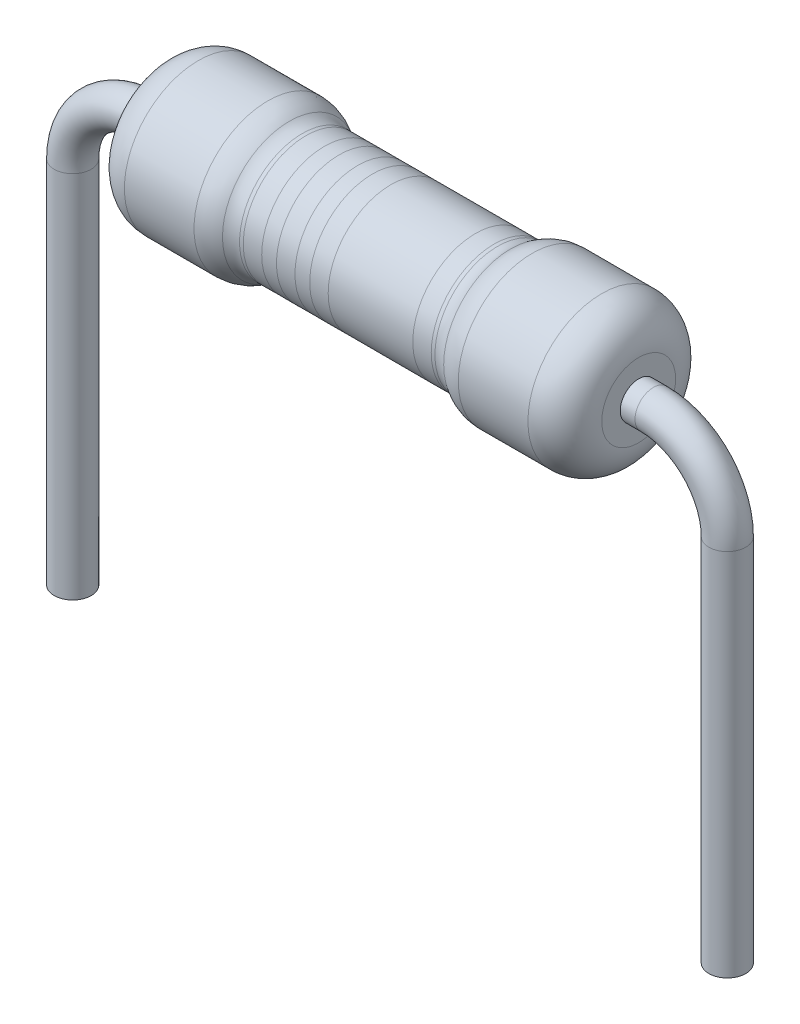
ISO-10303-21;
HEADER;
FILE_DESCRIPTION(('STEP AP214'),'2;1');
FILE_NAME('part.step','',(''),(''),'','','');
FILE_SCHEMA(('AUTOMOTIVE_DESIGN { 1 0 10303 214 1 1 1 1 }'));
ENDSEC;
DATA;
#1=APPLICATION_CONTEXT('core data for automotive mechanical design processes');
#2=APPLICATION_PROTOCOL_DEFINITION('international standard','automotive_design',2000,#1);
#3=PRODUCT_CONTEXT('',#1,'mechanical');
#4=PRODUCT('Part','Part','',(#3));
#5=PRODUCT_RELATED_PRODUCT_CATEGORY('part','',(#4));
#6=PRODUCT_DEFINITION_FORMATION('','',#4);
#7=PRODUCT_DEFINITION_CONTEXT('part definition',#1,'design');
#8=PRODUCT_DEFINITION('design','',#6,#7);
#9=PRODUCT_DEFINITION_SHAPE('','',#8);
#10=(LENGTH_UNIT() NAMED_UNIT(*) SI_UNIT(.MILLI.,.METRE.));
#11=(NAMED_UNIT(*) PLANE_ANGLE_UNIT() SI_UNIT($,.RADIAN.));
#12=(NAMED_UNIT(*) SI_UNIT($,.STERADIAN.) SOLID_ANGLE_UNIT());
#13=UNCERTAINTY_MEASURE_WITH_UNIT(LENGTH_MEASURE(1.E-05),#10,'distance_accuracy_value','');
#14=(GEOMETRIC_REPRESENTATION_CONTEXT(3) GLOBAL_UNCERTAINTY_ASSIGNED_CONTEXT((#13)) GLOBAL_UNIT_ASSIGNED_CONTEXT((#10,
#11,#12)) REPRESENTATION_CONTEXT('',''));
#15=CARTESIAN_POINT('',(0.,0.,0.));
#16=DIRECTION('',(0.,0.,1.));
#17=DIRECTION('',(1.,0.,0.));
#18=AXIS2_PLACEMENT_3D('',#15,#16,#17);
#19=CARTESIAN_POINT('',(6.464,0.,0.));
#20=DIRECTION('',(1.,0.,0.));
#21=DIRECTION('',(0.,0.,-1.));
#22=AXIS2_PLACEMENT_3D('',#19,#20,#21);
#23=CYLINDRICAL_SURFACE('',#22,0.85);
#24=CARTESIAN_POINT('',(3.10929753123185,0.,0.));
#25=DIRECTION('',(-1.,0.,0.));
#26=DIRECTION('',(0.,0.,1.));
#27=AXIS2_PLACEMENT_3D('',#24,#25,#26);
#28=CIRCLE('',#27,0.85);
#29=CARTESIAN_POINT('',(3.10929753123185,0.,0.85));
#30=VERTEX_POINT('',#29);
#31=EDGE_CURVE('E74',#30,#30,#28,.T.);
#32=ORIENTED_EDGE('',*,*,#31,.F.);
#33=EDGE_LOOP('',(#32));
#34=FACE_BOUND('',#33,.T.);
#35=CARTESIAN_POINT('',(4.25470246876815,0.,0.));
#36=DIRECTION('',(1.,0.,0.));
#37=DIRECTION('',(0.,0.,-1.));
#38=AXIS2_PLACEMENT_3D('',#35,#36,#37);
#39=CIRCLE('',#38,0.85);
#40=CARTESIAN_POINT('',(4.25470246876815,0.,-0.85));
#41=VERTEX_POINT('',#40);
#42=EDGE_CURVE('E58',#41,#41,#39,.T.);
#43=ORIENTED_EDGE('',*,*,#42,.F.);
#44=EDGE_LOOP('',(#43));
#45=FACE_BOUND('',#44,.T.);
#46=ADVANCED_FACE('F51',(#34,#45),#23,.T.);
#47=CARTESIAN_POINT('',(4.55470246876815,0.,0.));
#48=DIRECTION('',(1.,0.,0.));
#49=DIRECTION('',(0.,0.,-1.));
#50=AXIS2_PLACEMENT_3D('',#47,#48,#49);
#51=CIRCLE('',#50,0.85);
#52=CARTESIAN_POINT('',(4.55470246876815,0.,-0.85));
#53=VERTEX_POINT('',#52);
#54=EDGE_CURVE('E99',#53,#53,#51,.F.);
#55=ORIENTED_EDGE('',*,*,#54,.T.);
#56=EDGE_LOOP('',(#55));
#57=FACE_BOUND('',#56,.T.);
#58=CARTESIAN_POINT('',(4.50470246876815,0.,0.));
#59=DIRECTION('',(-1.,0.,0.));
#60=DIRECTION('',(0.,0.,1.));
#61=AXIS2_PLACEMENT_3D('',#58,#59,#60);
#62=CIRCLE('',#61,0.85);
#63=CARTESIAN_POINT('',(4.50470246876815,0.,0.85));
#64=VERTEX_POINT('',#63);
#65=EDGE_CURVE('E63',#64,#64,#62,.T.);
#66=ORIENTED_EDGE('',*,*,#65,.F.);
#67=EDGE_LOOP('',(#66));
#68=FACE_BOUND('',#67,.T.);
#69=ADVANCED_FACE('F168',(#57,#68),#23,.T.);
#70=CARTESIAN_POINT('',(2.65929753123185,0.,0.));
#71=DIRECTION('',(-1.,0.,0.));
#72=DIRECTION('',(0.,0.,1.));
#73=AXIS2_PLACEMENT_3D('',#70,#71,#72);
#74=CIRCLE('',#73,0.85);
#75=CARTESIAN_POINT('',(2.65929753123185,0.,0.85));
#76=VERTEX_POINT('',#75);
#77=EDGE_CURVE('E84',#76,#76,#74,.T.);
#78=ORIENTED_EDGE('',*,*,#77,.F.);
#79=EDGE_LOOP('',(#78));
#80=FACE_BOUND('',#79,.T.);
#81=CARTESIAN_POINT('',(2.85929753123185,0.,0.));
#82=DIRECTION('',(1.,0.,0.));
#83=DIRECTION('',(0.,0.,-1.));
#84=AXIS2_PLACEMENT_3D('',#81,#82,#83);
#85=CIRCLE('',#84,0.85);
#86=CARTESIAN_POINT('',(2.85929753123185,0.,-0.85));
#87=VERTEX_POINT('',#86);
#88=EDGE_CURVE('E72',#87,#87,#85,.T.);
#89=ORIENTED_EDGE('',*,*,#88,.F.);
#90=EDGE_LOOP('',(#89));
#91=FACE_BOUND('',#90,.T.);
#92=ADVANCED_FACE('F175',(#80,#91),#23,.T.);
#93=ORIENTED_EDGE('',*,*,#42,.T.);
#94=EDGE_LOOP('',(#93));
#95=FACE_BOUND('',#94,.T.);
#96=ORIENTED_EDGE('',*,*,#65,.T.);
#97=EDGE_LOOP('',(#96));
#98=FACE_BOUND('',#97,.T.);
#99=ADVANCED_FACE('F211',(#95,#98),#23,.T.);
#100=CARTESIAN_POINT('',(2.20929753123185,0.,0.));
#101=DIRECTION('',(-1.,0.,0.));
#102=DIRECTION('',(0.,0.,1.));
#103=AXIS2_PLACEMENT_3D('',#100,#101,#102);
#104=CIRCLE('',#103,0.85);
#105=CARTESIAN_POINT('',(2.20929753123185,0.,0.85));
#106=VERTEX_POINT('',#105);
#107=EDGE_CURVE('E92',#106,#106,#104,.T.);
#108=ORIENTED_EDGE('',*,*,#107,.F.);
#109=EDGE_LOOP('',(#108));
#110=FACE_BOUND('',#109,.T.);
#111=CARTESIAN_POINT('',(2.40929753123185,0.,0.));
#112=DIRECTION('',(1.,0.,0.));
#113=DIRECTION('',(0.,0.,-1.));
#114=AXIS2_PLACEMENT_3D('',#111,#112,#113);
#115=CIRCLE('',#114,0.85);
#116=CARTESIAN_POINT('',(2.40929753123185,0.,-0.85));
#117=VERTEX_POINT('',#116);
#118=EDGE_CURVE('E77',#117,#117,#115,.T.);
#119=ORIENTED_EDGE('',*,*,#118,.F.);
#120=EDGE_LOOP('',(#119));
#121=FACE_BOUND('',#120,.T.);
#122=ADVANCED_FACE('F216',(#110,#121),#23,.T.);
#123=ORIENTED_EDGE('',*,*,#88,.T.);
#124=EDGE_LOOP('',(#123));
#125=FACE_BOUND('',#124,.T.);
#126=ORIENTED_EDGE('',*,*,#31,.T.);
#127=EDGE_LOOP('',(#126));
#128=FACE_BOUND('',#127,.T.);
#129=ADVANCED_FACE('F203',(#125,#128),#23,.T.);
#130=CARTESIAN_POINT('',(1.90929753123185,0.,0.));
#131=DIRECTION('',(1.,0.,0.));
#132=DIRECTION('',(0.,0.,-1.));
#133=AXIS2_PLACEMENT_3D('',#130,#131,#132);
#134=CIRCLE('',#133,0.85);
#135=CARTESIAN_POINT('',(1.90929753123185,0.,-0.85));
#136=VERTEX_POINT('',#135);
#137=EDGE_CURVE('E102',#136,#136,#134,.T.);
#138=ORIENTED_EDGE('',*,*,#137,.T.);
#139=EDGE_LOOP('',(#138));
#140=FACE_BOUND('',#139,.T.);
#141=CARTESIAN_POINT('',(1.95929753123185,0.,0.));
#142=DIRECTION('',(1.,0.,0.));
#143=DIRECTION('',(0.,0.,-1.));
#144=AXIS2_PLACEMENT_3D('',#141,#142,#143);
#145=CIRCLE('',#144,0.85);
#146=CARTESIAN_POINT('',(1.95929753123185,0.,-0.85));
#147=VERTEX_POINT('',#146);
#148=EDGE_CURVE('E88',#147,#147,#145,.T.);
#149=ORIENTED_EDGE('',*,*,#148,.F.);
#150=EDGE_LOOP('',(#149));
#151=FACE_BOUND('',#150,.T.);
#152=ADVANCED_FACE('F195',(#140,#151),#23,.T.);
#153=ORIENTED_EDGE('',*,*,#118,.T.);
#154=EDGE_LOOP('',(#153));
#155=FACE_BOUND('',#154,.T.);
#156=ORIENTED_EDGE('',*,*,#77,.T.);
#157=EDGE_LOOP('',(#156));
#158=FACE_BOUND('',#157,.T.);
#159=ADVANCED_FACE('F184',(#155,#158),#23,.T.);
#160=CARTESIAN_POINT('',(6.464,0.,0.));
#161=DIRECTION('',(-1.,0.,0.));
#162=DIRECTION('',(0.,0.,1.));
#163=AXIS2_PLACEMENT_3D('',#160,#161,#162);
#164=CYLINDRICAL_SURFACE('',#163,1.);
#165=CARTESIAN_POINT('',(0.5,0.,0.));
#166=DIRECTION('',(1.,0.,0.));
#167=DIRECTION('',(0.,0.,-1.));
#168=AXIS2_PLACEMENT_3D('',#165,#166,#167);
#169=CIRCLE('',#168,1.);
#170=CARTESIAN_POINT('',(0.5,0.,-1.));
#171=VERTEX_POINT('',#170);
#172=EDGE_CURVE('E111',#171,#171,#169,.T.);
#173=ORIENTED_EDGE('',*,*,#172,.T.);
#174=EDGE_LOOP('',(#173));
#175=FACE_BOUND('',#174,.T.);
#176=CARTESIAN_POINT('',(1.44292857857286,0.,0.));
#177=DIRECTION('',(1.,0.,0.));
#178=DIRECTION('',(0.,0.,-1.));
#179=AXIS2_PLACEMENT_3D('',#176,#177,#178);
#180=CIRCLE('',#179,1.);
#181=CARTESIAN_POINT('',(1.44292857857286,0.,-1.));
#182=VERTEX_POINT('',#181);
#183=EDGE_CURVE('E114',#182,#182,#180,.F.);
#184=ORIENTED_EDGE('',*,*,#183,.T.);
#185=EDGE_LOOP('',(#184));
#186=FACE_BOUND('',#185,.T.);
#187=ADVANCED_FACE('F190',(#175,#186),#164,.T.);
#188=CARTESIAN_POINT('',(0.,0.,0.));
#189=DIRECTION('',(1.,0.,0.));
#190=DIRECTION('',(0.,0.,-1.));
#191=AXIS2_PLACEMENT_3D('',#188,#189,#190);
#192=PLANE('',#191);
#193=CARTESIAN_POINT('',(0.,0.,0.));
#194=DIRECTION('',(1.,0.,0.));
#195=DIRECTION('',(0.,0.,-1.));
#196=AXIS2_PLACEMENT_3D('',#193,#194,#195);
#197=CIRCLE('',#196,0.25);
#198=CARTESIAN_POINT('',(0.,0.,-0.25));
#199=VERTEX_POINT('',#198);
#200=EDGE_CURVE('E11',#199,#199,#197,.F.);
#201=ORIENTED_EDGE('',*,*,#200,.F.);
#202=EDGE_LOOP('',(#201));
#203=FACE_BOUND('',#202,.T.);
#204=CARTESIAN_POINT('',(0.,0.,0.));
#205=DIRECTION('',(1.,0.,0.));
#206=DIRECTION('',(0.,0.,-1.));
#207=AXIS2_PLACEMENT_3D('',#204,#205,#206);
#208=CIRCLE('',#207,0.5);
#209=CARTESIAN_POINT('',(0.,0.,-0.5));
#210=VERTEX_POINT('',#209);
#211=EDGE_CURVE('E108',#210,#210,#208,.F.);
#212=ORIENTED_EDGE('',*,*,#211,.T.);
#213=EDGE_LOOP('',(#212));
#214=FACE_BOUND('',#213,.T.);
#215=ADVANCED_FACE('F182',(#203,#214),#192,.F.);
#216=ORIENTED_EDGE('',*,*,#148,.T.);
#217=EDGE_LOOP('',(#216));
#218=FACE_BOUND('',#217,.T.);
#219=ORIENTED_EDGE('',*,*,#107,.T.);
#220=EDGE_LOOP('',(#219));
#221=FACE_BOUND('',#220,.T.);
#222=ADVANCED_FACE('F171',(#218,#221),#23,.T.);
#223=CARTESIAN_POINT('',(6.464,0.,0.));
#224=DIRECTION('',(1.,0.,0.));
#225=DIRECTION('',(0.,0.,-1.));
#226=AXIS2_PLACEMENT_3D('',#223,#224,#225);
#227=PLANE('',#226);
#228=CARTESIAN_POINT('',(6.464,0.,0.));
#229=DIRECTION('',(1.,0.,0.));
#230=DIRECTION('',(0.,0.,-1.));
#231=AXIS2_PLACEMENT_3D('',#228,#229,#230);
#232=CIRCLE('',#231,0.25);
#233=CARTESIAN_POINT('',(6.464,0.,-0.25));
#234=VERTEX_POINT('',#233);
#235=EDGE_CURVE('E144',#234,#234,#232,.F.);
#236=ORIENTED_EDGE('',*,*,#235,.T.);
#237=EDGE_LOOP('',(#236));
#238=FACE_BOUND('',#237,.T.);
#239=CARTESIAN_POINT('',(6.464,0.,0.));
#240=DIRECTION('',(1.,0.,0.));
#241=DIRECTION('',(0.,0.,-1.));
#242=AXIS2_PLACEMENT_3D('',#239,#240,#241);
#243=CIRCLE('',#242,0.5);
#244=CARTESIAN_POINT('',(6.464,0.,-0.5));
#245=VERTEX_POINT('',#244);
#246=EDGE_CURVE('E123',#245,#245,#243,.T.);
#247=ORIENTED_EDGE('',*,*,#246,.T.);
#248=EDGE_LOOP('',(#247));
#249=FACE_BOUND('',#248,.T.);
#250=ADVANCED_FACE('F148',(#238,#249),#227,.T.);
#251=CARTESIAN_POINT('',(5.964,0.,0.));
#252=DIRECTION('',(1.,0.,0.));
#253=DIRECTION('',(0.,0.,-1.));
#254=AXIS2_PLACEMENT_3D('',#251,#252,#253);
#255=CIRCLE('',#254,1.);
#256=CARTESIAN_POINT('',(5.964,0.,-1.));
#257=VERTEX_POINT('',#256);
#258=EDGE_CURVE('E117',#257,#257,#255,.F.);
#259=ORIENTED_EDGE('',*,*,#258,.T.);
#260=EDGE_LOOP('',(#259));
#261=FACE_BOUND('',#260,.T.);
#262=CARTESIAN_POINT('',(5.02107142142714,0.,0.));
#263=DIRECTION('',(-1.,0.,0.));
#264=DIRECTION('',(0.,0.,1.));
#265=AXIS2_PLACEMENT_3D('',#262,#263,#264);
#266=CIRCLE('',#265,1.);
#267=CARTESIAN_POINT('',(5.02107142142714,0.,1.));
#268=VERTEX_POINT('',#267);
#269=EDGE_CURVE('E120',#268,#268,#266,.F.);
#270=ORIENTED_EDGE('',*,*,#269,.T.);
#271=EDGE_LOOP('',(#270));
#272=FACE_BOUND('',#271,.T.);
#273=ADVANCED_FACE('F189',(#261,#272),#164,.T.);
#274=CARTESIAN_POINT('',(5.964,0.,0.));
#275=DIRECTION('',(1.,0.,0.));
#276=DIRECTION('',(0.,0.,-1.));
#277=AXIS2_PLACEMENT_3D('',#274,#275,#276);
#278=DEGENERATE_TOROIDAL_SURFACE('',#277,0.5,0.5,.T.);
#279=ORIENTED_EDGE('',*,*,#258,.F.);
#280=EDGE_LOOP('',(#279));
#281=FACE_BOUND('',#280,.T.);
#282=ORIENTED_EDGE('',*,*,#246,.F.);
#283=EDGE_LOOP('',(#282));
#284=FACE_BOUND('',#283,.T.);
#285=ADVANCED_FACE('F417',(#281,#284),#278,.T.);
#286=CARTESIAN_POINT('',(0.5,0.,0.));
#287=DIRECTION('',(1.,0.,0.));
#288=DIRECTION('',(0.,0.,-1.));
#289=AXIS2_PLACEMENT_3D('',#286,#287,#288);
#290=DEGENERATE_TOROIDAL_SURFACE('',#289,0.5,0.5,.T.);
#291=ORIENTED_EDGE('',*,*,#211,.F.);
#292=EDGE_LOOP('',(#291));
#293=FACE_BOUND('',#292,.T.);
#294=ORIENTED_EDGE('',*,*,#172,.F.);
#295=EDGE_LOOP('',(#294));
#296=FACE_BOUND('',#295,.T.);
#297=ADVANCED_FACE('F407',(#293,#296),#290,.T.);
#298=CARTESIAN_POINT('',(5.02107142142714,0.,0.));
#299=DIRECTION('',(-1.,0.,0.));
#300=DIRECTION('',(0.,0.,1.));
#301=AXIS2_PLACEMENT_3D('',#298,#299,#300);
#302=DEGENERATE_TOROIDAL_SURFACE('',#301,0.5,0.5,.T.);
#303=CARTESIAN_POINT('',(4.72959082601585,0.,0.));
#304=DIRECTION('',(1.,0.,0.));
#305=DIRECTION('',(0.,0.,-1.));
#306=AXIS2_PLACEMENT_3D('',#303,#304,#305);
#307=CIRCLE('',#306,0.906249999998378);
#308=CARTESIAN_POINT('',(4.72959082601585,0.,-0.906249999998378));
#309=VERTEX_POINT('',#308);
#310=EDGE_CURVE('E105',#309,#309,#307,.T.);
#311=ORIENTED_EDGE('',*,*,#310,.T.);
#312=EDGE_LOOP('',(#311));
#313=FACE_BOUND('',#312,.T.);
#314=ORIENTED_EDGE('',*,*,#269,.F.);
#315=EDGE_LOOP('',(#314));
#316=FACE_BOUND('',#315,.T.);
#317=ADVANCED_FACE('F398',(#313,#316),#302,.T.);
#318=CARTESIAN_POINT('',(1.44292857857286,0.,0.));
#319=DIRECTION('',(1.,0.,0.));
#320=DIRECTION('',(0.,0.,-1.));
#321=AXIS2_PLACEMENT_3D('',#318,#319,#320);
#322=DEGENERATE_TOROIDAL_SURFACE('',#321,0.5,0.5,.T.);
#323=CARTESIAN_POINT('',(1.73440917398415,0.,0.));
#324=DIRECTION('',(-1.,0.,0.));
#325=DIRECTION('',(0.,0.,1.));
#326=AXIS2_PLACEMENT_3D('',#323,#324,#325);
#327=CIRCLE('',#326,0.906249999998378);
#328=CARTESIAN_POINT('',(1.73440917398415,0.,0.906249999998378));
#329=VERTEX_POINT('',#328);
#330=EDGE_CURVE('E96',#329,#329,#327,.T.);
#331=ORIENTED_EDGE('',*,*,#330,.T.);
#332=EDGE_LOOP('',(#331));
#333=FACE_BOUND('',#332,.T.);
#334=ORIENTED_EDGE('',*,*,#183,.F.);
#335=EDGE_LOOP('',(#334));
#336=FACE_BOUND('',#335,.T.);
#337=ADVANCED_FACE('F389',(#333,#336),#322,.T.);
#338=CARTESIAN_POINT('',(4.55470246876815,0.,0.));
#339=DIRECTION('',(1.,0.,0.));
#340=DIRECTION('',(0.,0.,-1.));
#341=AXIS2_PLACEMENT_3D('',#338,#339,#340);
#342=TOROIDAL_SURFACE('',#341,1.1499999999987,0.3);
#343=ORIENTED_EDGE('',*,*,#54,.F.);
#344=EDGE_LOOP('',(#343));
#345=FACE_BOUND('',#344,.T.);
#346=ORIENTED_EDGE('',*,*,#310,.F.);
#347=EDGE_LOOP('',(#346));
#348=FACE_BOUND('',#347,.T.);
#349=ADVANCED_FACE('F380',(#345,#348),#342,.F.);
#350=CARTESIAN_POINT('',(1.90929753123185,0.,0.));
#351=DIRECTION('',(1.,0.,0.));
#352=DIRECTION('',(0.,0.,-1.));
#353=AXIS2_PLACEMENT_3D('',#350,#351,#352);
#354=TOROIDAL_SURFACE('',#353,1.1499999999987,0.3);
#355=ORIENTED_EDGE('',*,*,#330,.F.);
#356=EDGE_LOOP('',(#355));
#357=FACE_BOUND('',#356,.T.);
#358=ORIENTED_EDGE('',*,*,#137,.F.);
#359=EDGE_LOOP('',(#358));
#360=FACE_BOUND('',#359,.T.);
#361=ADVANCED_FACE('F53',(#357,#360),#354,.F.);
#362=CARTESIAN_POINT('',(-1.2,-6.,0.));
#363=DIRECTION('',(0.,1.,0.));
#364=DIRECTION('',(0.,0.,-1.));
#365=AXIS2_PLACEMENT_3D('',#362,#363,#364);
#366=PLANE('',#365);
#367=CARTESIAN_POINT('',(-1.2,-6.,0.));
#368=DIRECTION('',(0.,1.,0.));
#369=DIRECTION('',(0.,0.,-1.));
#370=AXIS2_PLACEMENT_3D('',#367,#368,#369);
#371=CIRCLE('',#370,0.25);
#372=CARTESIAN_POINT('',(-1.2,-6.,-0.25));
#373=VERTEX_POINT('',#372);
#374=EDGE_CURVE('E126',#373,#373,#371,.T.);
#375=ORIENTED_EDGE('',*,*,#374,.F.);
#376=EDGE_LOOP('',(#375));
#377=FACE_BOUND('',#376,.T.);
#378=ADVANCED_FACE('F317',(#377),#366,.F.);
#379=CARTESIAN_POINT('',(0.,0.,0.));
#380=DIRECTION('',(-1.,0.,0.));
#381=DIRECTION('',(0.,-1.,0.));
#382=AXIS2_PLACEMENT_3D('',#379,#380,#381);
#383=CYLINDRICAL_SURFACE('',#382,0.25);
#384=CARTESIAN_POINT('',(-0.2,0.,0.));
#385=DIRECTION('',(1.,0.,0.));
#386=DIRECTION('',(0.,0.,-1.));
#387=AXIS2_PLACEMENT_3D('',#384,#385,#386);
#388=CIRCLE('',#387,0.25);
#389=CARTESIAN_POINT('',(-0.2,0.25,0.));
#390=VERTEX_POINT('',#389);
#391=EDGE_CURVE('E132',#390,#390,#388,.T.);
#392=ORIENTED_EDGE('',*,*,#391,.T.);
#393=EDGE_LOOP('',(#392));
#394=FACE_BOUND('',#393,.T.);
#395=ORIENTED_EDGE('',*,*,#200,.T.);
#396=EDGE_LOOP('',(#395));
#397=FACE_BOUND('',#396,.T.);
#398=ADVANCED_FACE('F354',(#394,#397),#383,.T.);
#399=CARTESIAN_POINT('',(-0.2,-1.,0.));
#400=DIRECTION('',(0.,0.,1.));
#401=DIRECTION('',(1.,0.,0.));
#402=AXIS2_PLACEMENT_3D('',#399,#400,#401);
#403=TOROIDAL_SURFACE('',#402,1.,0.25);
#404=CARTESIAN_POINT('',(-1.2,-1.,0.));
#405=DIRECTION('',(0.,1.,0.));
#406=DIRECTION('',(0.,0.,-1.));
#407=AXIS2_PLACEMENT_3D('',#404,#405,#406);
#408=CIRCLE('',#407,0.25);
#409=CARTESIAN_POINT('',(-1.45,-1.,0.));
#410=VERTEX_POINT('',#409);
#411=EDGE_CURVE('E129',#410,#410,#408,.T.);
#412=CARTESIAN_POINT('',(-0.2,-1.,0.));
#413=DIRECTION('',(0.,0.,1.));
#414=DIRECTION('',(1.,0.,0.));
#415=AXIS2_PLACEMENT_3D('',#412,#413,#414);
#416=CIRCLE('',#415,1.25);
#417=EDGE_CURVE('',#390,#410,#416,.T.);
#418=ORIENTED_EDGE('',*,*,#391,.F.);
#419=ORIENTED_EDGE('',*,*,#411,.T.);
#420=ORIENTED_EDGE('',*,*,#417,.T.);
#421=ORIENTED_EDGE('',*,*,#417,.F.);
#422=EDGE_LOOP('',(#418,#420,#419,#421));
#423=FACE_BOUND('',#422,.T.);
#424=ADVANCED_FACE('F344',(#423),#403,.T.);
#425=CARTESIAN_POINT('',(-1.2,-1.,0.));
#426=DIRECTION('',(0.,-1.,0.));
#427=DIRECTION('',(1.,0.,0.));
#428=AXIS2_PLACEMENT_3D('',#425,#426,#427);
#429=CYLINDRICAL_SURFACE('',#428,0.25);
#430=ORIENTED_EDGE('',*,*,#374,.T.);
#431=EDGE_LOOP('',(#430));
#432=FACE_BOUND('',#431,.T.);
#433=ORIENTED_EDGE('',*,*,#411,.F.);
#434=EDGE_LOOP('',(#433));
#435=FACE_BOUND('',#434,.T.);
#436=ADVANCED_FACE('F164',(#432,#435),#429,.T.);
#437=CARTESIAN_POINT('',(7.664,-6.,0.));
#438=DIRECTION('',(0.,1.,0.));
#439=DIRECTION('',(0.,0.,-1.));
#440=AXIS2_PLACEMENT_3D('',#437,#438,#439);
#441=PLANE('',#440);
#442=CARTESIAN_POINT('',(7.664,-6.,0.));
#443=DIRECTION('',(0.,-1.,0.));
#444=DIRECTION('',(0.,0.,-1.));
#445=AXIS2_PLACEMENT_3D('',#442,#443,#444);
#446=CIRCLE('',#445,0.25);
#447=CARTESIAN_POINT('',(7.664,-6.,-0.25));
#448=VERTEX_POINT('',#447);
#449=EDGE_CURVE('E135',#448,#448,#446,.F.);
#450=ORIENTED_EDGE('',*,*,#449,.F.);
#451=EDGE_LOOP('',(#450));
#452=FACE_BOUND('',#451,.T.);
#453=ADVANCED_FACE('F154',(#452),#441,.F.);
#454=CARTESIAN_POINT('',(6.464,0.,0.));
#455=DIRECTION('',(1.,0.,0.));
#456=DIRECTION('',(0.,1.,0.));
#457=AXIS2_PLACEMENT_3D('',#454,#455,#456);
#458=CYLINDRICAL_SURFACE('',#457,0.25);
#459=CARTESIAN_POINT('',(6.664,0.,0.));
#460=DIRECTION('',(1.,0.,0.));
#461=DIRECTION('',(0.,0.,-1.));
#462=AXIS2_PLACEMENT_3D('',#459,#460,#461);
#463=CIRCLE('',#462,0.25);
#464=CARTESIAN_POINT('',(6.664,0.249999999999999,0.));
#465=VERTEX_POINT('',#464);
#466=EDGE_CURVE('E141',#465,#465,#463,.F.);
#467=ORIENTED_EDGE('',*,*,#466,.T.);
#468=EDGE_LOOP('',(#467));
#469=FACE_BOUND('',#468,.T.);
#470=ORIENTED_EDGE('',*,*,#235,.F.);
#471=EDGE_LOOP('',(#470));
#472=FACE_BOUND('',#471,.T.);
#473=ADVANCED_FACE('F151',(#469,#472),#458,.T.);
#474=CARTESIAN_POINT('',(6.664,-1.,0.));
#475=DIRECTION('',(0.,0.,-1.));
#476=DIRECTION('',(-1.,0.,0.));
#477=AXIS2_PLACEMENT_3D('',#474,#475,#476);
#478=TOROIDAL_SURFACE('',#477,0.999999999999999,0.25);
#479=CARTESIAN_POINT('',(7.664,-1.,0.));
#480=DIRECTION('',(0.,-1.,0.));
#481=DIRECTION('',(0.,0.,-1.));
#482=AXIS2_PLACEMENT_3D('',#479,#480,#481);
#483=CIRCLE('',#482,0.25);
#484=CARTESIAN_POINT('',(7.914,-1.,0.));
#485=VERTEX_POINT('',#484);
#486=EDGE_CURVE('E138',#485,#485,#483,.F.);
#487=CARTESIAN_POINT('',(6.664,-1.,0.));
#488=DIRECTION('',(0.,0.,-1.));
#489=DIRECTION('',(-1.,0.,0.));
#490=AXIS2_PLACEMENT_3D('',#487,#488,#489);
#491=CIRCLE('',#490,1.25);
#492=EDGE_CURVE('',#465,#485,#491,.T.);
#493=ORIENTED_EDGE('',*,*,#466,.F.);
#494=ORIENTED_EDGE('',*,*,#486,.T.);
#495=ORIENTED_EDGE('',*,*,#492,.T.);
#496=ORIENTED_EDGE('',*,*,#492,.F.);
#497=EDGE_LOOP('',(#493,#495,#494,#496));
#498=FACE_BOUND('',#497,.T.);
#499=ADVANCED_FACE('F153',(#498),#478,.T.);
#500=CARTESIAN_POINT('',(7.664,-1.,0.));
#501=DIRECTION('',(0.,-1.,0.));
#502=DIRECTION('',(1.,0.,0.));
#503=AXIS2_PLACEMENT_3D('',#500,#501,#502);
#504=CYLINDRICAL_SURFACE('',#503,0.25);
#505=ORIENTED_EDGE('',*,*,#449,.T.);
#506=EDGE_LOOP('',(#505));
#507=FACE_BOUND('',#506,.T.);
#508=ORIENTED_EDGE('',*,*,#486,.F.);
#509=EDGE_LOOP('',(#508));
#510=FACE_BOUND('',#509,.T.);
#511=ADVANCED_FACE('F161',(#507,#510),#504,.T.);
#512=CLOSED_SHELL('',(#46,#69,#92,#99,#122,#129,#152,#159,#187,#215,#222,#250,#273,#285,#297,
#317,#337,#349,#361,#378,#398,#424,#436,#453,#473,#499,#511));
#513=MANIFOLD_SOLID_BREP('B2',#512);
#514=ADVANCED_BREP_SHAPE_REPRESENTATION('',(#18,#513),#14);
#515=SHAPE_DEFINITION_REPRESENTATION(#9,#514);
ENDSEC;
END-ISO-10303-21;
